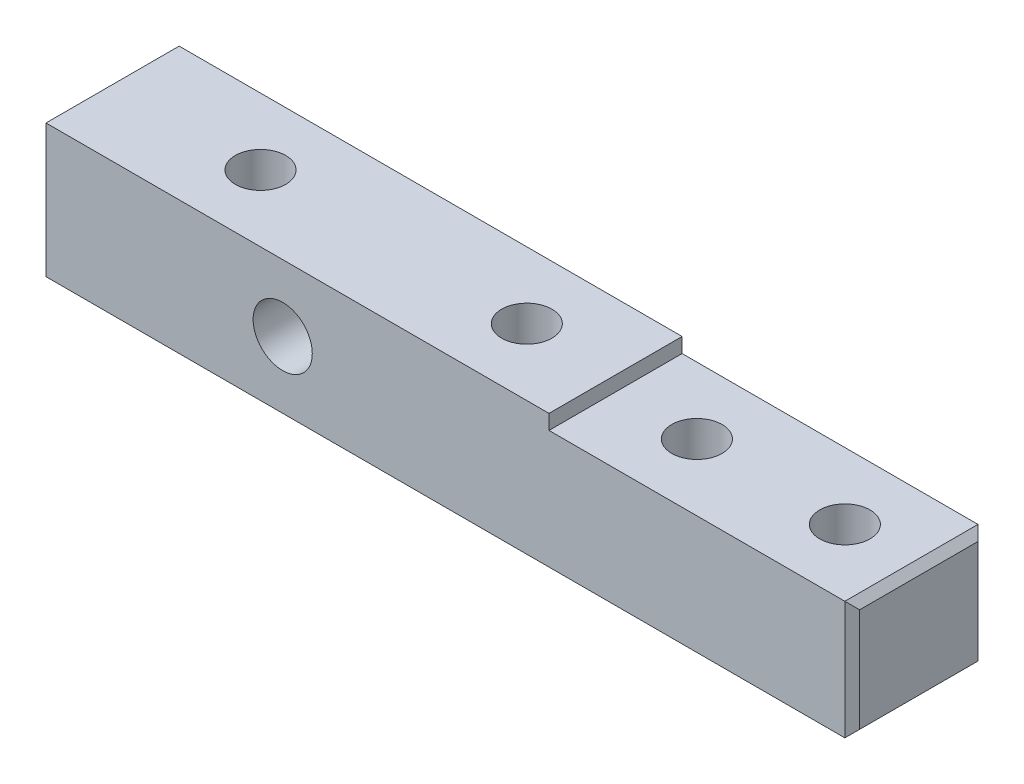
ISO-10303-21;
HEADER;
FILE_DESCRIPTION(('STEP AP214'),'2;1');
FILE_NAME('part.step','',(''),(''),'','','');
FILE_SCHEMA(('AUTOMOTIVE_DESIGN { 1 0 10303 214 1 1 1 1 }'));
ENDSEC;
DATA;
#1=APPLICATION_CONTEXT('core data for automotive mechanical design processes');
#2=APPLICATION_PROTOCOL_DEFINITION('international standard','automotive_design',2000,#1);
#3=PRODUCT_CONTEXT('',#1,'mechanical');
#4=PRODUCT('Part','Part','',(#3));
#5=PRODUCT_RELATED_PRODUCT_CATEGORY('part','',(#4));
#6=PRODUCT_DEFINITION_FORMATION('','',#4);
#7=PRODUCT_DEFINITION_CONTEXT('part definition',#1,'design');
#8=PRODUCT_DEFINITION('design','',#6,#7);
#9=PRODUCT_DEFINITION_SHAPE('','',#8);
#10=(LENGTH_UNIT() NAMED_UNIT(*) SI_UNIT(.MILLI.,.METRE.));
#11=(NAMED_UNIT(*) PLANE_ANGLE_UNIT() SI_UNIT($,.RADIAN.));
#12=(NAMED_UNIT(*) SI_UNIT($,.STERADIAN.) SOLID_ANGLE_UNIT());
#13=UNCERTAINTY_MEASURE_WITH_UNIT(LENGTH_MEASURE(1.E-05),#10,'distance_accuracy_value','');
#14=(GEOMETRIC_REPRESENTATION_CONTEXT(3) GLOBAL_UNCERTAINTY_ASSIGNED_CONTEXT((#13)) GLOBAL_UNIT_ASSIGNED_CONTEXT((#10,
#11,#12)) REPRESENTATION_CONTEXT('',''));
#15=CARTESIAN_POINT('',(0.,0.,0.));
#16=DIRECTION('',(0.,0.,1.));
#17=DIRECTION('',(1.,0.,0.));
#18=AXIS2_PLACEMENT_3D('',#15,#16,#17);
#19=CARTESIAN_POINT('',(0.,9.,9.));
#20=DIRECTION('',(1.,0.,0.));
#21=DIRECTION('',(0.,1.,0.));
#22=AXIS2_PLACEMENT_3D('',#19,#20,#21);
#23=PLANE('',#22);
#24=DIRECTION('',(0.,-1.,0.));
#25=VECTOR('',#24,1.);
#26=CARTESIAN_POINT('',(0.,9.,-8.00000000000003));
#27=LINE('',#26,#25);
#28=CARTESIAN_POINT('',(0.,8.00000000000002,-8.00000000000003));
#29=VERTEX_POINT('',#28);
#30=CARTESIAN_POINT('',(0.,-8.00000000000003,-8.00000000000003));
#31=VERTEX_POINT('',#30);
#32=EDGE_CURVE('E70',#29,#31,#27,.T.);
#33=ORIENTED_EDGE('',*,*,#32,.T.);
#34=DIRECTION('',(0.,0.,1.));
#35=VECTOR('',#34,1.);
#36=CARTESIAN_POINT('',(0.,-8.00000000000003,9.));
#37=LINE('',#36,#35);
#38=CARTESIAN_POINT('',(0.,-8.00000000000003,8.00000000000003));
#39=VERTEX_POINT('',#38);
#40=EDGE_CURVE('E62',#31,#39,#37,.T.);
#41=ORIENTED_EDGE('',*,*,#40,.T.);
#42=DIRECTION('',(0.,1.,0.));
#43=VECTOR('',#42,1.);
#44=CARTESIAN_POINT('',(0.,9.,8.00000000000003));
#45=LINE('',#44,#43);
#46=CARTESIAN_POINT('',(0.,8.00000000000002,8.00000000000003));
#47=VERTEX_POINT('',#46);
#48=EDGE_CURVE('E207',#39,#47,#45,.T.);
#49=ORIENTED_EDGE('',*,*,#48,.T.);
#50=DIRECTION('',(0.,0.,-1.));
#51=VECTOR('',#50,1.);
#52=CARTESIAN_POINT('',(0.,8.00000000000002,9.));
#53=LINE('',#52,#51);
#54=EDGE_CURVE('E75',#47,#29,#53,.T.);
#55=ORIENTED_EDGE('',*,*,#54,.T.);
#56=EDGE_LOOP('',(#33,#41,#49,#55));
#57=FACE_BOUND('',#56,.T.);
#58=ADVANCED_FACE('F51',(#57),#23,.F.);
#59=CARTESIAN_POINT('',(0.,-9.,9.));
#60=DIRECTION('',(0.,1.,0.));
#61=DIRECTION('',(-1.,0.,0.));
#62=AXIS2_PLACEMENT_3D('',#59,#60,#61);
#63=PLANE('',#62);
#64=CARTESIAN_POINT('',(21.,-9.00000000000001,0.));
#65=DIRECTION('',(0.,1.,0.));
#66=DIRECTION('',(0.,0.,1.));
#67=AXIS2_PLACEMENT_3D('',#64,#65,#66);
#68=CIRCLE('',#67,3.4);
#69=CARTESIAN_POINT('',(21.,-9.00000000000001,3.4));
#70=VERTEX_POINT('',#69);
#71=EDGE_CURVE('E596',#70,#70,#68,.T.);
#72=ORIENTED_EDGE('',*,*,#71,.T.);
#73=EDGE_LOOP('',(#72));
#74=FACE_BOUND('',#73,.T.);
#75=CARTESIAN_POINT('',(57.,-9.00000000000001,0.));
#76=DIRECTION('',(0.,1.,0.));
#77=DIRECTION('',(0.,0.,1.));
#78=AXIS2_PLACEMENT_3D('',#75,#76,#77);
#79=CIRCLE('',#78,3.39999999999999);
#80=CARTESIAN_POINT('',(57.,-9.00000000000001,3.39999999999999));
#81=VERTEX_POINT('',#80);
#82=EDGE_CURVE('E586',#81,#81,#79,.T.);
#83=ORIENTED_EDGE('',*,*,#82,.T.);
#84=EDGE_LOOP('',(#83));
#85=FACE_BOUND('',#84,.T.);
#86=CARTESIAN_POINT('',(80.,-9.00000000000001,0.));
#87=DIRECTION('',(0.,1.,0.));
#88=DIRECTION('',(0.,0.,1.));
#89=AXIS2_PLACEMENT_3D('',#86,#87,#88);
#90=CIRCLE('',#89,3.4);
#91=CARTESIAN_POINT('',(80.,-9.00000000000001,3.4));
#92=VERTEX_POINT('',#91);
#93=EDGE_CURVE('E581',#92,#92,#90,.T.);
#94=ORIENTED_EDGE('',*,*,#93,.T.);
#95=EDGE_LOOP('',(#94));
#96=FACE_BOUND('',#95,.T.);
#97=CARTESIAN_POINT('',(100.,-9.00000000000001,0.));
#98=DIRECTION('',(0.,1.,0.));
#99=DIRECTION('',(0.,0.,1.));
#100=AXIS2_PLACEMENT_3D('',#97,#98,#99);
#101=CIRCLE('',#100,3.4);
#102=CARTESIAN_POINT('',(100.,-9.00000000000001,3.4));
#103=VERTEX_POINT('',#102);
#104=EDGE_CURVE('E571',#103,#103,#101,.T.);
#105=ORIENTED_EDGE('',*,*,#104,.T.);
#106=EDGE_LOOP('',(#105));
#107=FACE_BOUND('',#106,.T.);
#108=DIRECTION('',(1.,0.,0.));
#109=VECTOR('',#108,1.);
#110=CARTESIAN_POINT('',(0.,-9.,-9.));
#111=LINE('',#110,#109);
#112=CARTESIAN_POINT('',(0.999999999999989,-9.,-9.));
#113=VERTEX_POINT('',#112);
#114=CARTESIAN_POINT('',(109.,-8.99999999999993,-9.));
#115=VERTEX_POINT('',#114);
#116=EDGE_CURVE('E161',#113,#115,#111,.T.);
#117=ORIENTED_EDGE('',*,*,#116,.T.);
#118=DIRECTION('',(0.,0.,1.));
#119=VECTOR('',#118,1.);
#120=CARTESIAN_POINT('',(109.,-8.99999999999993,9.));
#121=LINE('',#120,#119);
#122=CARTESIAN_POINT('',(109.,-8.99999999999993,9.));
#123=VERTEX_POINT('',#122);
#124=EDGE_CURVE('E189',#115,#123,#121,.T.);
#125=ORIENTED_EDGE('',*,*,#124,.T.);
#126=DIRECTION('',(1.,0.,0.));
#127=VECTOR('',#126,1.);
#128=CARTESIAN_POINT('',(0.,-9.,9.));
#129=LINE('',#128,#127);
#130=CARTESIAN_POINT('',(0.999999999999989,-9.,9.));
#131=VERTEX_POINT('',#130);
#132=EDGE_CURVE('E160',#131,#123,#129,.T.);
#133=ORIENTED_EDGE('',*,*,#132,.F.);
#134=DIRECTION('',(0.,0.,-1.));
#135=VECTOR('',#134,1.);
#136=CARTESIAN_POINT('',(0.999999999999988,-9.,9.));
#137=LINE('',#136,#135);
#138=EDGE_CURVE('E185',#131,#113,#137,.T.);
#139=ORIENTED_EDGE('',*,*,#138,.T.);
#140=EDGE_LOOP('',(#117,#125,#133,#139));
#141=FACE_BOUND('',#140,.T.);
#142=ADVANCED_FACE('F257',(#74,#85,#96,#107,#141),#63,.F.);
#143=CARTESIAN_POINT('',(110.,9.,9.));
#144=DIRECTION('',(-1.,0.,0.));
#145=DIRECTION('',(0.,0.,1.));
#146=AXIS2_PLACEMENT_3D('',#143,#144,#145);
#147=PLANE('',#146);
#148=DIRECTION('',(0.,-1.,0.));
#149=VECTOR('',#148,1.);
#150=CARTESIAN_POINT('',(110.,-8.99999999999993,8.));
#151=LINE('',#150,#149);
#152=CARTESIAN_POINT('',(110.,6.,8.));
#153=VERTEX_POINT('',#152);
#154=CARTESIAN_POINT('',(110.,-7.99999999999993,8.));
#155=VERTEX_POINT('',#154);
#156=EDGE_CURVE('E172',#153,#155,#151,.T.);
#157=ORIENTED_EDGE('',*,*,#156,.T.);
#158=DIRECTION('',(0.,0.,-1.));
#159=VECTOR('',#158,1.);
#160=CARTESIAN_POINT('',(110.,-7.99999999999993,9.));
#161=LINE('',#160,#159);
#162=CARTESIAN_POINT('',(110.,-7.99999999999993,-8.));
#163=VERTEX_POINT('',#162);
#164=EDGE_CURVE('E181',#155,#163,#161,.T.);
#165=ORIENTED_EDGE('',*,*,#164,.T.);
#166=DIRECTION('',(0.,1.,0.));
#167=VECTOR('',#166,1.);
#168=CARTESIAN_POINT('',(110.,9.,-8.));
#169=LINE('',#168,#167);
#170=CARTESIAN_POINT('',(110.,6.,-8.));
#171=VERTEX_POINT('',#170);
#172=EDGE_CURVE('E178',#163,#171,#169,.T.);
#173=ORIENTED_EDGE('',*,*,#172,.T.);
#174=DIRECTION('',(0.,0.,1.));
#175=VECTOR('',#174,1.);
#176=CARTESIAN_POINT('',(110.,6.,9.));
#177=LINE('',#176,#175);
#178=EDGE_CURVE('E175',#171,#153,#177,.T.);
#179=ORIENTED_EDGE('',*,*,#178,.T.);
#180=EDGE_LOOP('',(#157,#165,#173,#179));
#181=FACE_BOUND('',#180,.T.);
#182=ADVANCED_FACE('F262',(#181),#147,.F.);
#183=CARTESIAN_POINT('',(0.,9.,9.));
#184=DIRECTION('',(0.,-1.,0.));
#185=DIRECTION('',(1.,0.,0.));
#186=AXIS2_PLACEMENT_3D('',#183,#184,#185);
#187=PLANE('',#186);
#188=CARTESIAN_POINT('',(21.,9.,0.));
#189=DIRECTION('',(0.,1.,0.));
#190=DIRECTION('',(0.,0.,1.));
#191=AXIS2_PLACEMENT_3D('',#188,#189,#190);
#192=CIRCLE('',#191,3.4);
#193=CARTESIAN_POINT('',(21.,9.,3.4));
#194=VERTEX_POINT('',#193);
#195=EDGE_CURVE('E230',#194,#194,#192,.T.);
#196=ORIENTED_EDGE('',*,*,#195,.F.);
#197=EDGE_LOOP('',(#196));
#198=FACE_BOUND('',#197,.T.);
#199=CARTESIAN_POINT('',(57.,9.,0.));
#200=DIRECTION('',(0.,1.,0.));
#201=DIRECTION('',(0.,0.,1.));
#202=AXIS2_PLACEMENT_3D('',#199,#200,#201);
#203=CIRCLE('',#202,3.4);
#204=CARTESIAN_POINT('',(57.,9.,3.4));
#205=VERTEX_POINT('',#204);
#206=EDGE_CURVE('E591',#205,#205,#203,.T.);
#207=ORIENTED_EDGE('',*,*,#206,.F.);
#208=EDGE_LOOP('',(#207));
#209=FACE_BOUND('',#208,.T.);
#210=DIRECTION('',(-1.,0.,0.));
#211=VECTOR('',#210,1.);
#212=CARTESIAN_POINT('',(0.,9.,-9.));
#213=LINE('',#212,#211);
#214=CARTESIAN_POINT('',(69.,9.,-9.));
#215=VERTEX_POINT('',#214);
#216=CARTESIAN_POINT('',(0.999999999999984,9.,-9.));
#217=VERTEX_POINT('',#216);
#218=EDGE_CURVE('E149',#215,#217,#213,.T.);
#219=ORIENTED_EDGE('',*,*,#218,.T.);
#220=DIRECTION('',(0.,0.,1.));
#221=VECTOR('',#220,1.);
#222=CARTESIAN_POINT('',(0.999999999999984,9.,9.));
#223=LINE('',#222,#221);
#224=CARTESIAN_POINT('',(0.999999999999984,9.,9.));
#225=VERTEX_POINT('',#224);
#226=EDGE_CURVE('E11',#217,#225,#223,.T.);
#227=ORIENTED_EDGE('',*,*,#226,.T.);
#228=DIRECTION('',(-1.,0.,0.));
#229=VECTOR('',#228,1.);
#230=CARTESIAN_POINT('',(0.,9.,9.));
#231=LINE('',#230,#229);
#232=CARTESIAN_POINT('',(69.,9.,9.));
#233=VERTEX_POINT('',#232);
#234=EDGE_CURVE('E152',#233,#225,#231,.T.);
#235=ORIENTED_EDGE('',*,*,#234,.F.);
#236=DIRECTION('',(0.,0.,1.));
#237=VECTOR('',#236,1.);
#238=CARTESIAN_POINT('',(69.,9.,-9.));
#239=LINE('',#238,#237);
#240=EDGE_CURVE('E135',#215,#233,#239,.T.);
#241=ORIENTED_EDGE('',*,*,#240,.F.);
#242=EDGE_LOOP('',(#219,#227,#235,#241));
#243=FACE_BOUND('',#242,.T.);
#244=ADVANCED_FACE('F148',(#198,#209,#243),#187,.F.);
#245=CARTESIAN_POINT('',(0.,0.,9.));
#246=DIRECTION('',(0.,0.,1.));
#247=DIRECTION('',(1.,0.,0.));
#248=AXIS2_PLACEMENT_3D('',#245,#246,#247);
#249=PLANE('',#248);
#250=CARTESIAN_POINT('',(33.,0.,9.));
#251=DIRECTION('',(0.,0.,1.));
#252=DIRECTION('',(1.,0.,0.));
#253=AXIS2_PLACEMENT_3D('',#250,#251,#252);
#254=CIRCLE('',#253,4.);
#255=CARTESIAN_POINT('',(37.,0.,9.));
#256=VERTEX_POINT('',#255);
#257=EDGE_CURVE('E562',#256,#256,#254,.T.);
#258=ORIENTED_EDGE('',*,*,#257,.F.);
#259=EDGE_LOOP('',(#258));
#260=FACE_BOUND('',#259,.T.);
#261=ORIENTED_EDGE('',*,*,#132,.T.);
#262=DIRECTION('',(0.,1.,0.));
#263=VECTOR('',#262,1.);
#264=CARTESIAN_POINT('',(109.,7.,9.));
#265=LINE('',#264,#263);
#266=CARTESIAN_POINT('',(109.,7.,9.));
#267=VERTEX_POINT('',#266);
#268=EDGE_CURVE('E204',#123,#267,#265,.T.);
#269=ORIENTED_EDGE('',*,*,#268,.T.);
#270=DIRECTION('',(1.,0.,0.));
#271=VECTOR('',#270,1.);
#272=CARTESIAN_POINT('',(110.,7.,9.));
#273=LINE('',#272,#271);
#274=CARTESIAN_POINT('',(69.,6.99999999999999,9.));
#275=VERTEX_POINT('',#274);
#276=EDGE_CURVE('E143',#275,#267,#273,.T.);
#277=ORIENTED_EDGE('',*,*,#276,.F.);
#278=DIRECTION('',(0.,-1.,0.));
#279=VECTOR('',#278,1.);
#280=CARTESIAN_POINT('',(69.,9.,9.));
#281=LINE('',#280,#279);
#282=EDGE_CURVE('E523',#233,#275,#281,.T.);
#283=ORIENTED_EDGE('',*,*,#282,.F.);
#284=ORIENTED_EDGE('',*,*,#234,.T.);
#285=DIRECTION('',(0.,-1.,0.));
#286=VECTOR('',#285,1.);
#287=CARTESIAN_POINT('',(0.999999999999989,-9.,9.));
#288=LINE('',#287,#286);
#289=EDGE_CURVE('E201',#225,#131,#288,.T.);
#290=ORIENTED_EDGE('',*,*,#289,.T.);
#291=EDGE_LOOP('',(#261,#269,#277,#283,#284,#290));
#292=FACE_BOUND('',#291,.T.);
#293=ADVANCED_FACE('F391',(#260,#292),#249,.T.);
#294=CARTESIAN_POINT('',(0.,0.,-9.));
#295=DIRECTION('',(0.,0.,1.));
#296=DIRECTION('',(1.,0.,0.));
#297=AXIS2_PLACEMENT_3D('',#294,#295,#296);
#298=PLANE('',#297);
#299=CARTESIAN_POINT('',(33.,0.,-9.));
#300=DIRECTION('',(0.,0.,1.));
#301=DIRECTION('',(1.,0.,0.));
#302=AXIS2_PLACEMENT_3D('',#299,#300,#301);
#303=CIRCLE('',#302,4.);
#304=CARTESIAN_POINT('',(37.,0.,-9.));
#305=VERTEX_POINT('',#304);
#306=EDGE_CURVE('E526',#305,#305,#303,.T.);
#307=ORIENTED_EDGE('',*,*,#306,.T.);
#308=EDGE_LOOP('',(#307));
#309=FACE_BOUND('',#308,.T.);
#310=DIRECTION('',(1.,0.,0.));
#311=VECTOR('',#310,1.);
#312=CARTESIAN_POINT('',(110.,7.,-9.));
#313=LINE('',#312,#311);
#314=CARTESIAN_POINT('',(69.,6.99999999999999,-9.));
#315=VERTEX_POINT('',#314);
#316=CARTESIAN_POINT('',(109.,7.,-9.));
#317=VERTEX_POINT('',#316);
#318=EDGE_CURVE('E142',#315,#317,#313,.T.);
#319=ORIENTED_EDGE('',*,*,#318,.T.);
#320=DIRECTION('',(0.,-1.,0.));
#321=VECTOR('',#320,1.);
#322=CARTESIAN_POINT('',(109.,0.,-9.));
#323=LINE('',#322,#321);
#324=EDGE_CURVE('E195',#317,#115,#323,.T.);
#325=ORIENTED_EDGE('',*,*,#324,.T.);
#326=ORIENTED_EDGE('',*,*,#116,.F.);
#327=DIRECTION('',(0.,1.,0.));
#328=VECTOR('',#327,1.);
#329=CARTESIAN_POINT('',(0.999999999999986,0.,-9.));
#330=LINE('',#329,#328);
#331=EDGE_CURVE('E158',#113,#217,#330,.T.);
#332=ORIENTED_EDGE('',*,*,#331,.T.);
#333=ORIENTED_EDGE('',*,*,#218,.F.);
#334=DIRECTION('',(0.,-1.,0.));
#335=VECTOR('',#334,1.);
#336=CARTESIAN_POINT('',(69.,9.,-9.));
#337=LINE('',#336,#335);
#338=EDGE_CURVE('E131',#215,#315,#337,.T.);
#339=ORIENTED_EDGE('',*,*,#338,.T.);
#340=EDGE_LOOP('',(#319,#325,#326,#332,#333,#339));
#341=FACE_BOUND('',#340,.T.);
#342=ADVANCED_FACE('F155',(#309,#341),#298,.F.);
#343=CARTESIAN_POINT('',(110.,7.,-9.));
#344=DIRECTION('',(0.,-1.,0.));
#345=DIRECTION('',(1.,0.,0.));
#346=AXIS2_PLACEMENT_3D('',#343,#344,#345);
#347=PLANE('',#346);
#348=CARTESIAN_POINT('',(80.,6.99999999999999,0.));
#349=DIRECTION('',(0.,-1.,0.));
#350=DIRECTION('',(1.,0.,0.));
#351=AXIS2_PLACEMENT_3D('',#348,#349,#350);
#352=CIRCLE('',#351,3.4);
#353=CARTESIAN_POINT('',(83.4,6.99999999999999,0.));
#354=VERTEX_POINT('',#353);
#355=EDGE_CURVE('E576',#354,#354,#352,.T.);
#356=ORIENTED_EDGE('',*,*,#355,.T.);
#357=EDGE_LOOP('',(#356));
#358=FACE_BOUND('',#357,.T.);
#359=CARTESIAN_POINT('',(100.,7.,0.));
#360=DIRECTION('',(0.,-1.,0.));
#361=DIRECTION('',(1.,0.,0.));
#362=AXIS2_PLACEMENT_3D('',#359,#360,#361);
#363=CIRCLE('',#362,3.4);
#364=CARTESIAN_POINT('',(103.4,7.,0.));
#365=VERTEX_POINT('',#364);
#366=EDGE_CURVE('E566',#365,#365,#363,.T.);
#367=ORIENTED_EDGE('',*,*,#366,.T.);
#368=EDGE_LOOP('',(#367));
#369=FACE_BOUND('',#368,.T.);
#370=ORIENTED_EDGE('',*,*,#276,.T.);
#371=DIRECTION('',(0.,0.,-1.));
#372=VECTOR('',#371,1.);
#373=CARTESIAN_POINT('',(109.,7.,-9.));
#374=LINE('',#373,#372);
#375=EDGE_CURVE('E198',#267,#317,#374,.T.);
#376=ORIENTED_EDGE('',*,*,#375,.T.);
#377=ORIENTED_EDGE('',*,*,#318,.F.);
#378=DIRECTION('',(0.,0.,1.));
#379=VECTOR('',#378,1.);
#380=CARTESIAN_POINT('',(69.,6.99999999999999,-9.));
#381=LINE('',#380,#379);
#382=EDGE_CURVE('E137',#315,#275,#381,.T.);
#383=ORIENTED_EDGE('',*,*,#382,.T.);
#384=EDGE_LOOP('',(#370,#376,#377,#383));
#385=FACE_BOUND('',#384,.T.);
#386=ADVANCED_FACE('F378',(#358,#369,#385),#347,.F.);
#387=CARTESIAN_POINT('',(69.,9.,-9.));
#388=DIRECTION('',(-1.,0.,0.));
#389=DIRECTION('',(0.,0.,1.));
#390=AXIS2_PLACEMENT_3D('',#387,#388,#389);
#391=PLANE('',#390);
#392=ORIENTED_EDGE('',*,*,#282,.T.);
#393=ORIENTED_EDGE('',*,*,#382,.F.);
#394=ORIENTED_EDGE('',*,*,#338,.F.);
#395=ORIENTED_EDGE('',*,*,#240,.T.);
#396=EDGE_LOOP('',(#392,#393,#394,#395));
#397=FACE_BOUND('',#396,.T.);
#398=ADVANCED_FACE('F134',(#397),#391,.F.);
#399=CARTESIAN_POINT('',(33.,0.,9.));
#400=DIRECTION('',(0.,0.,1.));
#401=DIRECTION('',(1.,0.,0.));
#402=AXIS2_PLACEMENT_3D('',#399,#400,#401);
#403=CYLINDRICAL_SURFACE('',#402,4.);
#404=ORIENTED_EDGE('',*,*,#306,.F.);
#405=EDGE_LOOP('',(#404));
#406=FACE_BOUND('',#405,.T.);
#407=ORIENTED_EDGE('',*,*,#257,.T.);
#408=EDGE_LOOP('',(#407));
#409=FACE_BOUND('',#408,.T.);
#410=ADVANCED_FACE('F361',(#406,#409),#403,.F.);
#411=CARTESIAN_POINT('',(100.,9.,0.));
#412=DIRECTION('',(0.,1.,0.));
#413=DIRECTION('',(0.,0.,1.));
#414=AXIS2_PLACEMENT_3D('',#411,#412,#413);
#415=CYLINDRICAL_SURFACE('',#414,3.4);
#416=ORIENTED_EDGE('',*,*,#104,.F.);
#417=EDGE_LOOP('',(#416));
#418=FACE_BOUND('',#417,.T.);
#419=ORIENTED_EDGE('',*,*,#366,.F.);
#420=EDGE_LOOP('',(#419));
#421=FACE_BOUND('',#420,.T.);
#422=ADVANCED_FACE('F353',(#418,#421),#415,.F.);
#423=CARTESIAN_POINT('',(80.,9.,0.));
#424=DIRECTION('',(0.,1.,0.));
#425=DIRECTION('',(0.,0.,1.));
#426=AXIS2_PLACEMENT_3D('',#423,#424,#425);
#427=CYLINDRICAL_SURFACE('',#426,3.4);
#428=ORIENTED_EDGE('',*,*,#93,.F.);
#429=EDGE_LOOP('',(#428));
#430=FACE_BOUND('',#429,.T.);
#431=ORIENTED_EDGE('',*,*,#355,.F.);
#432=EDGE_LOOP('',(#431));
#433=FACE_BOUND('',#432,.T.);
#434=ADVANCED_FACE('F345',(#430,#433),#427,.F.);
#435=CARTESIAN_POINT('',(57.,9.,0.));
#436=DIRECTION('',(0.,1.,0.));
#437=DIRECTION('',(0.,0.,1.));
#438=AXIS2_PLACEMENT_3D('',#435,#436,#437);
#439=CYLINDRICAL_SURFACE('',#438,3.4);
#440=ORIENTED_EDGE('',*,*,#82,.F.);
#441=EDGE_LOOP('',(#440));
#442=FACE_BOUND('',#441,.T.);
#443=ORIENTED_EDGE('',*,*,#206,.T.);
#444=EDGE_LOOP('',(#443));
#445=FACE_BOUND('',#444,.T.);
#446=ADVANCED_FACE('F337',(#442,#445),#439,.F.);
#447=CARTESIAN_POINT('',(21.,9.,0.));
#448=DIRECTION('',(0.,1.,0.));
#449=DIRECTION('',(0.,0.,1.));
#450=AXIS2_PLACEMENT_3D('',#447,#448,#449);
#451=CYLINDRICAL_SURFACE('',#450,3.4);
#452=ORIENTED_EDGE('',*,*,#71,.F.);
#453=EDGE_LOOP('',(#452));
#454=FACE_BOUND('',#453,.T.);
#455=ORIENTED_EDGE('',*,*,#195,.T.);
#456=EDGE_LOOP('',(#455));
#457=FACE_BOUND('',#456,.T.);
#458=ADVANCED_FACE('F294',(#454,#457),#451,.F.);
#459=CARTESIAN_POINT('',(110.,6.,9.));
#460=DIRECTION('',(-0.707106781186547,-0.707106781186547,0.));
#461=DIRECTION('',(0.,0.,1.));
#462=AXIS2_PLACEMENT_3D('',#459,#460,#461);
#463=PLANE('',#462);
#464=DIRECTION('',(-0.577350269189626,0.577350269189626,-0.577350269189626));
#465=VECTOR('',#464,1.);
#466=CARTESIAN_POINT('',(115.666666666667,0.33333333333333,-2.33333333333333));
#467=LINE('',#466,#465);
#468=EDGE_CURVE('E222',#317,#171,#467,.F.);
#469=ORIENTED_EDGE('',*,*,#468,.F.);
#470=ORIENTED_EDGE('',*,*,#375,.F.);
#471=DIRECTION('',(0.577350269189626,-0.577350269189626,-0.577350269189626));
#472=VECTOR('',#471,1.);
#473=CARTESIAN_POINT('',(111.333333333333,4.66666666666667,6.66666666666667));
#474=LINE('',#473,#472);
#475=EDGE_CURVE('E226',#153,#267,#474,.F.);
#476=ORIENTED_EDGE('',*,*,#475,.F.);
#477=ORIENTED_EDGE('',*,*,#178,.F.);
#478=EDGE_LOOP('',(#469,#470,#476,#477));
#479=FACE_BOUND('',#478,.T.);
#480=ADVANCED_FACE('F288',(#479),#463,.F.);
#481=CARTESIAN_POINT('',(109.,0.,9.));
#482=DIRECTION('',(0.707106781186547,0.,0.707106781186547));
#483=DIRECTION('',(0.,-1.,0.));
#484=AXIS2_PLACEMENT_3D('',#481,#482,#483);
#485=PLANE('',#484);
#486=ORIENTED_EDGE('',*,*,#475,.T.);
#487=ORIENTED_EDGE('',*,*,#268,.F.);
#488=DIRECTION('',(-0.577350269189625,-0.577350269189627,0.577350269189625));
#489=VECTOR('',#488,1.);
#490=CARTESIAN_POINT('',(112.,-5.99999999999994,6.00000000000002));
#491=LINE('',#490,#489);
#492=EDGE_CURVE('E219',#155,#123,#491,.T.);
#493=ORIENTED_EDGE('',*,*,#492,.F.);
#494=ORIENTED_EDGE('',*,*,#156,.F.);
#495=EDGE_LOOP('',(#486,#487,#493,#494));
#496=FACE_BOUND('',#495,.T.);
#497=ADVANCED_FACE('F281',(#496),#485,.T.);
#498=CARTESIAN_POINT('',(110.,9.,-8.));
#499=DIRECTION('',(-0.707106781186547,0.,0.707106781186547));
#500=DIRECTION('',(0.,1.,0.));
#501=AXIS2_PLACEMENT_3D('',#498,#499,#500);
#502=PLANE('',#501);
#503=ORIENTED_EDGE('',*,*,#468,.T.);
#504=ORIENTED_EDGE('',*,*,#172,.F.);
#505=DIRECTION('',(-0.577350269189625,-0.577350269189627,-0.577350269189625));
#506=VECTOR('',#505,1.);
#507=CARTESIAN_POINT('',(115.666666666667,-2.33333333333326,-2.33333333333335));
#508=LINE('',#507,#506);
#509=EDGE_CURVE('E216',#115,#163,#508,.F.);
#510=ORIENTED_EDGE('',*,*,#509,.F.);
#511=ORIENTED_EDGE('',*,*,#324,.F.);
#512=EDGE_LOOP('',(#503,#504,#510,#511));
#513=FACE_BOUND('',#512,.T.);
#514=ADVANCED_FACE('F274',(#513),#502,.F.);
#515=CARTESIAN_POINT('',(110.,-7.99999999999993,9.));
#516=DIRECTION('',(-0.707106781186549,0.707106781186546,0.));
#517=DIRECTION('',(0.,0.,-1.));
#518=AXIS2_PLACEMENT_3D('',#515,#516,#517);
#519=PLANE('',#518);
#520=ORIENTED_EDGE('',*,*,#492,.T.);
#521=ORIENTED_EDGE('',*,*,#124,.F.);
#522=ORIENTED_EDGE('',*,*,#509,.T.);
#523=ORIENTED_EDGE('',*,*,#164,.F.);
#524=EDGE_LOOP('',(#520,#521,#522,#523));
#525=FACE_BOUND('',#524,.T.);
#526=ADVANCED_FACE('F268',(#525),#519,.F.);
#527=CARTESIAN_POINT('',(0.,8.00000000000002,9.));
#528=DIRECTION('',(0.707106781186543,-0.707106781186552,0.));
#529=DIRECTION('',(0.,0.,-1.));
#530=AXIS2_PLACEMENT_3D('',#527,#528,#529);
#531=PLANE('',#530);
#532=DIRECTION('',(-0.577350269189631,-0.577350269189623,0.577350269189623));
#533=VECTOR('',#532,1.);
#534=CARTESIAN_POINT('',(-5.6666666666667,2.3333333333334,-2.3333333333334));
#535=LINE('',#534,#533);
#536=EDGE_CURVE('E236',#29,#217,#535,.F.);
#537=ORIENTED_EDGE('',*,*,#536,.F.);
#538=ORIENTED_EDGE('',*,*,#54,.F.);
#539=DIRECTION('',(0.577350269189631,0.577350269189623,0.577350269189623));
#540=VECTOR('',#539,1.);
#541=CARTESIAN_POINT('',(-2.00000000000003,6.00000000000003,6.00000000000003));
#542=LINE('',#541,#540);
#543=EDGE_CURVE('E56',#225,#47,#542,.F.);
#544=ORIENTED_EDGE('',*,*,#543,.F.);
#545=ORIENTED_EDGE('',*,*,#226,.F.);
#546=EDGE_LOOP('',(#537,#538,#544,#545));
#547=FACE_BOUND('',#546,.T.);
#548=ADVANCED_FACE('F54',(#547),#531,.F.);
#549=CARTESIAN_POINT('',(0.999999999999986,0.,9.));
#550=DIRECTION('',(-0.707106781186543,0.,0.707106781186552));
#551=DIRECTION('',(0.,1.,0.));
#552=AXIS2_PLACEMENT_3D('',#549,#550,#551);
#553=PLANE('',#552);
#554=ORIENTED_EDGE('',*,*,#543,.T.);
#555=ORIENTED_EDGE('',*,*,#48,.F.);
#556=DIRECTION('',(-0.577350269189631,0.577350269189623,-0.577350269189623));
#557=VECTOR('',#556,1.);
#558=CARTESIAN_POINT('',(-2.00000000000003,-6.00000000000003,6.00000000000003));
#559=LINE('',#558,#557);
#560=EDGE_CURVE('E234',#131,#39,#559,.T.);
#561=ORIENTED_EDGE('',*,*,#560,.F.);
#562=ORIENTED_EDGE('',*,*,#289,.F.);
#563=EDGE_LOOP('',(#554,#555,#561,#562));
#564=FACE_BOUND('',#563,.T.);
#565=ADVANCED_FACE('F248',(#564),#553,.T.);
#566=CARTESIAN_POINT('',(0.,9.,-8.00000000000003));
#567=DIRECTION('',(0.707106781186543,0.,0.707106781186552));
#568=DIRECTION('',(0.,-1.,0.));
#569=AXIS2_PLACEMENT_3D('',#566,#567,#568);
#570=PLANE('',#569);
#571=ORIENTED_EDGE('',*,*,#536,.T.);
#572=ORIENTED_EDGE('',*,*,#331,.F.);
#573=DIRECTION('',(-0.577350269189631,0.577350269189623,0.577350269189623));
#574=VECTOR('',#573,1.);
#575=CARTESIAN_POINT('',(-5.6666666666667,-2.33333333333341,-2.3333333333334));
#576=LINE('',#575,#574);
#577=EDGE_CURVE('E231',#31,#113,#576,.F.);
#578=ORIENTED_EDGE('',*,*,#577,.F.);
#579=ORIENTED_EDGE('',*,*,#32,.F.);
#580=EDGE_LOOP('',(#571,#572,#578,#579));
#581=FACE_BOUND('',#580,.T.);
#582=ADVANCED_FACE('F252',(#581),#570,.F.);
#583=CARTESIAN_POINT('',(0.999999999999989,-9.,9.));
#584=DIRECTION('',(0.707106781186542,0.707106781186553,0.));
#585=DIRECTION('',(0.,0.,-1.));
#586=AXIS2_PLACEMENT_3D('',#583,#584,#585);
#587=PLANE('',#586);
#588=ORIENTED_EDGE('',*,*,#560,.T.);
#589=ORIENTED_EDGE('',*,*,#40,.F.);
#590=ORIENTED_EDGE('',*,*,#577,.T.);
#591=ORIENTED_EDGE('',*,*,#138,.F.);
#592=EDGE_LOOP('',(#588,#589,#590,#591));
#593=FACE_BOUND('',#592,.T.);
#594=ADVANCED_FACE('F255',(#593),#587,.F.);
#595=CLOSED_SHELL('',(#58,#142,#182,#244,#293,#342,#386,#398,#410,#422,#434,#446,#458,#480,#497,
#514,#526,#548,#565,#582,#594));
#596=MANIFOLD_SOLID_BREP('B2',#595);
#597=ADVANCED_BREP_SHAPE_REPRESENTATION('',(#18,#596),#14);
#598=SHAPE_DEFINITION_REPRESENTATION(#9,#597);
ENDSEC;
END-ISO-10303-21;
